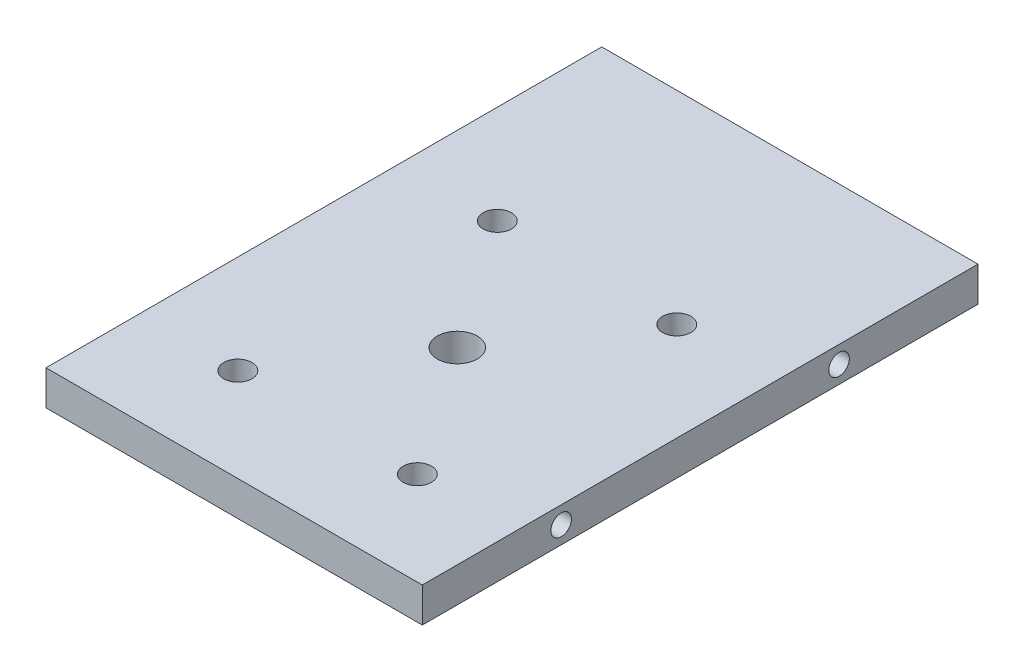
ISO-10303-21;
HEADER;
FILE_DESCRIPTION(('STEP AP214'),'2;1');
FILE_NAME('part.step','',(''),(''),'','','');
FILE_SCHEMA(('AUTOMOTIVE_DESIGN { 1 0 10303 214 1 1 1 1 }'));
ENDSEC;
DATA;
#1=APPLICATION_CONTEXT('core data for automotive mechanical design processes');
#2=APPLICATION_PROTOCOL_DEFINITION('international standard','automotive_design',2000,#1);
#3=PRODUCT_CONTEXT('',#1,'mechanical');
#4=PRODUCT('Part','Part','',(#3));
#5=PRODUCT_RELATED_PRODUCT_CATEGORY('part','',(#4));
#6=PRODUCT_DEFINITION_FORMATION('','',#4);
#7=PRODUCT_DEFINITION_CONTEXT('part definition',#1,'design');
#8=PRODUCT_DEFINITION('design','',#6,#7);
#9=PRODUCT_DEFINITION_SHAPE('','',#8);
#10=(LENGTH_UNIT() NAMED_UNIT(*) SI_UNIT(.MILLI.,.METRE.));
#11=(NAMED_UNIT(*) PLANE_ANGLE_UNIT() SI_UNIT($,.RADIAN.));
#12=(NAMED_UNIT(*) SI_UNIT($,.STERADIAN.) SOLID_ANGLE_UNIT());
#13=UNCERTAINTY_MEASURE_WITH_UNIT(LENGTH_MEASURE(1.E-05),#10,'distance_accuracy_value','');
#14=(GEOMETRIC_REPRESENTATION_CONTEXT(3) GLOBAL_UNCERTAINTY_ASSIGNED_CONTEXT((#13)) GLOBAL_UNIT_ASSIGNED_CONTEXT((#10,
#11,#12)) REPRESENTATION_CONTEXT('',''));
#15=CARTESIAN_POINT('',(0.,0.,0.));
#16=DIRECTION('',(0.,0.,1.));
#17=DIRECTION('',(1.,0.,0.));
#18=AXIS2_PLACEMENT_3D('',#15,#16,#17);
#19=CARTESIAN_POINT('',(0.,3.,0.));
#20=DIRECTION('',(1.,0.,0.));
#21=DIRECTION('',(0.,0.,-1.));
#22=AXIS2_PLACEMENT_3D('',#19,#20,#21);
#23=PLANE('',#22);
#24=CARTESIAN_POINT('',(0.,1.5,-36.));
#25=DIRECTION('',(-1.,0.,0.));
#26=DIRECTION('',(0.,0.,1.));
#27=AXIS2_PLACEMENT_3D('',#24,#25,#26);
#28=CIRCLE('',#27,0.889);
#29=CARTESIAN_POINT('',(0.,1.5,-35.111));
#30=VERTEX_POINT('',#29);
#31=EDGE_CURVE('E126',#30,#30,#28,.T.);
#32=ORIENTED_EDGE('',*,*,#31,.F.);
#33=EDGE_LOOP('',(#32));
#34=FACE_BOUND('',#33,.T.);
#35=CARTESIAN_POINT('',(0.,1.5,-12.));
#36=DIRECTION('',(-1.,0.,0.));
#37=DIRECTION('',(0.,0.,1.));
#38=AXIS2_PLACEMENT_3D('',#35,#36,#37);
#39=CIRCLE('',#38,0.889);
#40=CARTESIAN_POINT('',(0.,1.5,-11.111));
#41=VERTEX_POINT('',#40);
#42=EDGE_CURVE('E132',#41,#41,#39,.T.);
#43=ORIENTED_EDGE('',*,*,#42,.F.);
#44=EDGE_LOOP('',(#43));
#45=FACE_BOUND('',#44,.T.);
#46=DIRECTION('',(0.,0.,1.));
#47=VECTOR('',#46,1.);
#48=CARTESIAN_POINT('',(0.,0.,0.));
#49=LINE('',#48,#47);
#50=CARTESIAN_POINT('',(0.,0.,-48.));
#51=VERTEX_POINT('',#50);
#52=CARTESIAN_POINT('',(0.,0.,0.));
#53=VERTEX_POINT('',#52);
#54=EDGE_CURVE('E138',#51,#53,#49,.T.);
#55=ORIENTED_EDGE('',*,*,#54,.T.);
#56=DIRECTION('',(0.,-1.,0.));
#57=VECTOR('',#56,1.);
#58=CARTESIAN_POINT('',(0.,3.,0.));
#59=LINE('',#58,#57);
#60=CARTESIAN_POINT('',(0.,3.,0.));
#61=VERTEX_POINT('',#60);
#62=EDGE_CURVE('E11',#61,#53,#59,.T.);
#63=ORIENTED_EDGE('',*,*,#62,.F.);
#64=DIRECTION('',(0.,0.,1.));
#65=VECTOR('',#64,1.);
#66=CARTESIAN_POINT('',(0.,3.,0.));
#67=LINE('',#66,#65);
#68=CARTESIAN_POINT('',(0.,3.,-48.));
#69=VERTEX_POINT('',#68);
#70=EDGE_CURVE('E139',#69,#61,#67,.T.);
#71=ORIENTED_EDGE('',*,*,#70,.F.);
#72=DIRECTION('',(0.,-1.,0.));
#73=VECTOR('',#72,1.);
#74=CARTESIAN_POINT('',(0.,3.,-48.));
#75=LINE('',#74,#73);
#76=EDGE_CURVE('E145',#69,#51,#75,.T.);
#77=ORIENTED_EDGE('',*,*,#76,.T.);
#78=EDGE_LOOP('',(#55,#63,#71,#77));
#79=FACE_BOUND('',#78,.T.);
#80=ADVANCED_FACE('F43',(#34,#45,#79),#23,.F.);
#81=CARTESIAN_POINT('',(0.,3.,0.));
#82=DIRECTION('',(0.,0.,-1.));
#83=DIRECTION('',(-1.,0.,0.));
#84=AXIS2_PLACEMENT_3D('',#81,#82,#83);
#85=PLANE('',#84);
#86=DIRECTION('',(1.,0.,0.));
#87=VECTOR('',#86,1.);
#88=CARTESIAN_POINT('',(0.,0.,0.));
#89=LINE('',#88,#87);
#90=CARTESIAN_POINT('',(32.5,0.,0.));
#91=VERTEX_POINT('',#90);
#92=EDGE_CURVE('E148',#53,#91,#89,.T.);
#93=ORIENTED_EDGE('',*,*,#92,.T.);
#94=DIRECTION('',(0.,-1.,0.));
#95=VECTOR('',#94,1.);
#96=CARTESIAN_POINT('',(32.5,3.,0.));
#97=LINE('',#96,#95);
#98=CARTESIAN_POINT('',(32.5,3.,0.));
#99=VERTEX_POINT('',#98);
#100=EDGE_CURVE('E51',#99,#91,#97,.T.);
#101=ORIENTED_EDGE('',*,*,#100,.F.);
#102=DIRECTION('',(1.,0.,0.));
#103=VECTOR('',#102,1.);
#104=CARTESIAN_POINT('',(0.,3.,0.));
#105=LINE('',#104,#103);
#106=EDGE_CURVE('E90',#61,#99,#105,.T.);
#107=ORIENTED_EDGE('',*,*,#106,.F.);
#108=ORIENTED_EDGE('',*,*,#62,.T.);
#109=EDGE_LOOP('',(#93,#101,#107,#108));
#110=FACE_BOUND('',#109,.T.);
#111=ADVANCED_FACE('F172',(#110),#85,.F.);
#112=CARTESIAN_POINT('',(32.5,3.,0.));
#113=DIRECTION('',(-1.,0.,0.));
#114=DIRECTION('',(0.,0.,1.));
#115=AXIS2_PLACEMENT_3D('',#112,#113,#114);
#116=PLANE('',#115);
#117=CARTESIAN_POINT('',(32.5,1.5,-12.));
#118=DIRECTION('',(1.,0.,0.));
#119=DIRECTION('',(0.,0.,-1.));
#120=AXIS2_PLACEMENT_3D('',#117,#118,#119);
#121=CIRCLE('',#120,0.888999999999989);
#122=CARTESIAN_POINT('',(32.5,1.5,-12.889));
#123=VERTEX_POINT('',#122);
#124=EDGE_CURVE('E114',#123,#123,#121,.T.);
#125=ORIENTED_EDGE('',*,*,#124,.F.);
#126=EDGE_LOOP('',(#125));
#127=FACE_BOUND('',#126,.T.);
#128=CARTESIAN_POINT('',(32.5,1.5,-36.));
#129=DIRECTION('',(1.,0.,0.));
#130=DIRECTION('',(0.,0.,-1.));
#131=AXIS2_PLACEMENT_3D('',#128,#129,#130);
#132=CIRCLE('',#131,0.888999999999989);
#133=CARTESIAN_POINT('',(32.5,1.5,-36.889));
#134=VERTEX_POINT('',#133);
#135=EDGE_CURVE('E113',#134,#134,#132,.T.);
#136=ORIENTED_EDGE('',*,*,#135,.F.);
#137=EDGE_LOOP('',(#136));
#138=FACE_BOUND('',#137,.T.);
#139=DIRECTION('',(0.,0.,-1.));
#140=VECTOR('',#139,1.);
#141=CARTESIAN_POINT('',(32.5,0.,0.));
#142=LINE('',#141,#140);
#143=CARTESIAN_POINT('',(32.5,0.,-48.));
#144=VERTEX_POINT('',#143);
#145=EDGE_CURVE('E77',#91,#144,#142,.T.);
#146=ORIENTED_EDGE('',*,*,#145,.T.);
#147=DIRECTION('',(0.,-1.,0.));
#148=VECTOR('',#147,1.);
#149=CARTESIAN_POINT('',(32.5,3.,-48.));
#150=LINE('',#149,#148);
#151=CARTESIAN_POINT('',(32.5,3.,-48.));
#152=VERTEX_POINT('',#151);
#153=EDGE_CURVE('E153',#152,#144,#150,.T.);
#154=ORIENTED_EDGE('',*,*,#153,.F.);
#155=DIRECTION('',(0.,0.,-1.));
#156=VECTOR('',#155,1.);
#157=CARTESIAN_POINT('',(32.5,3.,0.));
#158=LINE('',#157,#156);
#159=EDGE_CURVE('E142',#99,#152,#158,.T.);
#160=ORIENTED_EDGE('',*,*,#159,.F.);
#161=ORIENTED_EDGE('',*,*,#100,.T.);
#162=EDGE_LOOP('',(#146,#154,#160,#161));
#163=FACE_BOUND('',#162,.T.);
#164=ADVANCED_FACE('F155',(#127,#138,#163),#116,.F.);
#165=CARTESIAN_POINT('',(0.,3.,-48.));
#166=DIRECTION('',(0.,0.,1.));
#167=DIRECTION('',(1.,0.,0.));
#168=AXIS2_PLACEMENT_3D('',#165,#166,#167);
#169=PLANE('',#168);
#170=DIRECTION('',(-1.,0.,0.));
#171=VECTOR('',#170,1.);
#172=CARTESIAN_POINT('',(0.,0.,-48.));
#173=LINE('',#172,#171);
#174=EDGE_CURVE('E83',#144,#51,#173,.T.);
#175=ORIENTED_EDGE('',*,*,#174,.T.);
#176=ORIENTED_EDGE('',*,*,#76,.F.);
#177=DIRECTION('',(-1.,0.,0.));
#178=VECTOR('',#177,1.);
#179=CARTESIAN_POINT('',(0.,3.,-48.));
#180=LINE('',#179,#178);
#181=EDGE_CURVE('E59',#152,#69,#180,.T.);
#182=ORIENTED_EDGE('',*,*,#181,.F.);
#183=ORIENTED_EDGE('',*,*,#153,.T.);
#184=EDGE_LOOP('',(#175,#176,#182,#183));
#185=FACE_BOUND('',#184,.T.);
#186=ADVANCED_FACE('F162',(#185),#169,.F.);
#187=CARTESIAN_POINT('',(0.,3.,0.));
#188=DIRECTION('',(0.,-1.,0.));
#189=DIRECTION('',(0.,0.,-1.));
#190=AXIS2_PLACEMENT_3D('',#187,#188,#189);
#191=PLANE('',#190);
#192=CARTESIAN_POINT('',(24.,3.,-30.48));
#193=DIRECTION('',(0.,1.,0.));
#194=DIRECTION('',(0.,0.,1.));
#195=AXIS2_PLACEMENT_3D('',#192,#193,#194);
#196=CIRCLE('',#195,1.22);
#197=CARTESIAN_POINT('',(24.,3.,-29.26));
#198=VERTEX_POINT('',#197);
#199=EDGE_CURVE('E237',#198,#198,#196,.T.);
#200=ORIENTED_EDGE('',*,*,#199,.F.);
#201=EDGE_LOOP('',(#200));
#202=FACE_BOUND('',#201,.T.);
#203=CARTESIAN_POINT('',(8.5,3.,-8.07));
#204=DIRECTION('',(0.,1.,0.));
#205=DIRECTION('',(0.,0.,1.));
#206=AXIS2_PLACEMENT_3D('',#203,#204,#205);
#207=CIRCLE('',#206,1.22);
#208=CARTESIAN_POINT('',(8.5,3.,-6.85));
#209=VERTEX_POINT('',#208);
#210=EDGE_CURVE('E233',#209,#209,#207,.T.);
#211=ORIENTED_EDGE('',*,*,#210,.F.);
#212=EDGE_LOOP('',(#211));
#213=FACE_BOUND('',#212,.T.);
#214=CARTESIAN_POINT('',(24.,3.,-8.07));
#215=DIRECTION('',(0.,1.,0.));
#216=DIRECTION('',(0.,0.,1.));
#217=AXIS2_PLACEMENT_3D('',#214,#215,#216);
#218=CIRCLE('',#217,1.22);
#219=CARTESIAN_POINT('',(24.,3.,-6.85));
#220=VERTEX_POINT('',#219);
#221=EDGE_CURVE('E241',#220,#220,#218,.T.);
#222=ORIENTED_EDGE('',*,*,#221,.F.);
#223=EDGE_LOOP('',(#222));
#224=FACE_BOUND('',#223,.T.);
#225=CARTESIAN_POINT('',(8.5,3.,-30.48));
#226=DIRECTION('',(0.,1.,0.));
#227=DIRECTION('',(0.,0.,1.));
#228=AXIS2_PLACEMENT_3D('',#225,#226,#227);
#229=CIRCLE('',#228,1.22);
#230=CARTESIAN_POINT('',(8.5,3.,-29.26));
#231=VERTEX_POINT('',#230);
#232=EDGE_CURVE('E229',#231,#231,#229,.T.);
#233=ORIENTED_EDGE('',*,*,#232,.F.);
#234=EDGE_LOOP('',(#233));
#235=FACE_BOUND('',#234,.T.);
#236=CARTESIAN_POINT('',(16.25,3.,-19.275));
#237=DIRECTION('',(0.,1.,0.));
#238=DIRECTION('',(0.,0.,1.));
#239=AXIS2_PLACEMENT_3D('',#236,#237,#238);
#240=CIRCLE('',#239,1.7272);
#241=CARTESIAN_POINT('',(16.25,3.,-17.5478));
#242=VERTEX_POINT('',#241);
#243=EDGE_CURVE('E225',#242,#242,#240,.T.);
#244=ORIENTED_EDGE('',*,*,#243,.F.);
#245=EDGE_LOOP('',(#244));
#246=FACE_BOUND('',#245,.T.);
#247=ORIENTED_EDGE('',*,*,#70,.T.);
#248=ORIENTED_EDGE('',*,*,#106,.T.);
#249=ORIENTED_EDGE('',*,*,#159,.T.);
#250=ORIENTED_EDGE('',*,*,#181,.T.);
#251=EDGE_LOOP('',(#247,#248,#249,#250));
#252=FACE_BOUND('',#251,.T.);
#253=ADVANCED_FACE('F164',(#202,#213,#224,#235,#246,#252),#191,.F.);
#254=CARTESIAN_POINT('',(0.,0.,0.));
#255=DIRECTION('',(0.,-1.,0.));
#256=DIRECTION('',(0.,0.,-1.));
#257=AXIS2_PLACEMENT_3D('',#254,#255,#256);
#258=PLANE('',#257);
#259=CARTESIAN_POINT('',(24.,0.,-30.48));
#260=DIRECTION('',(0.,1.,0.));
#261=DIRECTION('',(0.,0.,1.));
#262=AXIS2_PLACEMENT_3D('',#259,#260,#261);
#263=CIRCLE('',#262,1.22);
#264=CARTESIAN_POINT('',(24.,0.,-29.26));
#265=VERTEX_POINT('',#264);
#266=EDGE_CURVE('E209',#265,#265,#263,.T.);
#267=ORIENTED_EDGE('',*,*,#266,.T.);
#268=EDGE_LOOP('',(#267));
#269=FACE_BOUND('',#268,.T.);
#270=CARTESIAN_POINT('',(8.5,0.,-8.07));
#271=DIRECTION('',(0.,1.,0.));
#272=DIRECTION('',(0.,0.,1.));
#273=AXIS2_PLACEMENT_3D('',#270,#271,#272);
#274=CIRCLE('',#273,1.22);
#275=CARTESIAN_POINT('',(8.5,0.,-6.85));
#276=VERTEX_POINT('',#275);
#277=EDGE_CURVE('E213',#276,#276,#274,.T.);
#278=ORIENTED_EDGE('',*,*,#277,.T.);
#279=EDGE_LOOP('',(#278));
#280=FACE_BOUND('',#279,.T.);
#281=CARTESIAN_POINT('',(24.,0.,-8.07));
#282=DIRECTION('',(0.,1.,0.));
#283=DIRECTION('',(0.,0.,1.));
#284=AXIS2_PLACEMENT_3D('',#281,#282,#283);
#285=CIRCLE('',#284,1.22);
#286=CARTESIAN_POINT('',(24.,0.,-6.85));
#287=VERTEX_POINT('',#286);
#288=EDGE_CURVE('E217',#287,#287,#285,.T.);
#289=ORIENTED_EDGE('',*,*,#288,.T.);
#290=EDGE_LOOP('',(#289));
#291=FACE_BOUND('',#290,.T.);
#292=CARTESIAN_POINT('',(8.5,0.,-30.48));
#293=DIRECTION('',(0.,1.,0.));
#294=DIRECTION('',(0.,0.,1.));
#295=AXIS2_PLACEMENT_3D('',#292,#293,#294);
#296=CIRCLE('',#295,1.22);
#297=CARTESIAN_POINT('',(8.5,0.,-29.26));
#298=VERTEX_POINT('',#297);
#299=EDGE_CURVE('E221',#298,#298,#296,.T.);
#300=ORIENTED_EDGE('',*,*,#299,.T.);
#301=EDGE_LOOP('',(#300));
#302=FACE_BOUND('',#301,.T.);
#303=CARTESIAN_POINT('',(16.25,0.,-19.275));
#304=DIRECTION('',(0.,-1.,0.));
#305=DIRECTION('',(0.,0.,-1.));
#306=AXIS2_PLACEMENT_3D('',#303,#304,#305);
#307=CIRCLE('',#306,1.7272);
#308=CARTESIAN_POINT('',(16.25,0.,-21.0022));
#309=VERTEX_POINT('',#308);
#310=EDGE_CURVE('E120',#309,#309,#307,.T.);
#311=ORIENTED_EDGE('',*,*,#310,.F.);
#312=EDGE_LOOP('',(#311));
#313=FACE_BOUND('',#312,.T.);
#314=ORIENTED_EDGE('',*,*,#54,.F.);
#315=ORIENTED_EDGE('',*,*,#174,.F.);
#316=ORIENTED_EDGE('',*,*,#145,.F.);
#317=ORIENTED_EDGE('',*,*,#92,.F.);
#318=EDGE_LOOP('',(#314,#315,#316,#317));
#319=FACE_BOUND('',#318,.T.);
#320=ADVANCED_FACE('F158',(#269,#280,#291,#302,#313,#319),#258,.T.);
#321=CARTESIAN_POINT('',(7.4658349096845,1.5,-12.));
#322=DIRECTION('',(-1.,0.,0.));
#323=DIRECTION('',(0.,0.,1.));
#324=AXIS2_PLACEMENT_3D('',#321,#322,#323);
#325=CONICAL_SURFACE('',#324,0.888999999999998,1.02974425867665);
#326=CARTESIAN_POINT('',(8.,1.5,-12.));
#327=VERTEX_POINT('',#326);
#328=VERTEX_LOOP('',#327);
#329=FACE_BOUND('',#328,.T.);
#330=CARTESIAN_POINT('',(7.4658349096845,1.5,-12.));
#331=DIRECTION('',(-1.,0.,0.));
#332=DIRECTION('',(0.,0.,1.));
#333=AXIS2_PLACEMENT_3D('',#330,#331,#332);
#334=CIRCLE('',#333,0.888999999999998);
#335=CARTESIAN_POINT('',(7.4658349096845,1.5,-11.111));
#336=VERTEX_POINT('',#335);
#337=EDGE_CURVE('E135',#336,#336,#334,.T.);
#338=ORIENTED_EDGE('',*,*,#337,.T.);
#339=EDGE_LOOP('',(#338));
#340=FACE_BOUND('',#339,.T.);
#341=ADVANCED_FACE('F188',(#329,#340),#325,.F.);
#342=CARTESIAN_POINT('',(0.,1.5,-12.));
#343=DIRECTION('',(-1.,0.,0.));
#344=DIRECTION('',(0.,0.,1.));
#345=AXIS2_PLACEMENT_3D('',#342,#343,#344);
#346=CYLINDRICAL_SURFACE('',#345,0.888999999999999);
#347=ORIENTED_EDGE('',*,*,#337,.F.);
#348=EDGE_LOOP('',(#347));
#349=FACE_BOUND('',#348,.T.);
#350=ORIENTED_EDGE('',*,*,#42,.T.);
#351=EDGE_LOOP('',(#350));
#352=FACE_BOUND('',#351,.T.);
#353=ADVANCED_FACE('F185',(#349,#352),#346,.F.);
#354=CARTESIAN_POINT('',(7.4658349096845,1.5,-36.));
#355=DIRECTION('',(-1.,0.,0.));
#356=DIRECTION('',(0.,0.,1.));
#357=AXIS2_PLACEMENT_3D('',#354,#355,#356);
#358=CONICAL_SURFACE('',#357,0.888999999999998,1.02974425867665);
#359=CARTESIAN_POINT('',(8.,1.5,-36.));
#360=VERTEX_POINT('',#359);
#361=VERTEX_LOOP('',#360);
#362=FACE_BOUND('',#361,.T.);
#363=CARTESIAN_POINT('',(7.4658349096845,1.5,-36.));
#364=DIRECTION('',(-1.,0.,0.));
#365=DIRECTION('',(0.,0.,1.));
#366=AXIS2_PLACEMENT_3D('',#363,#364,#365);
#367=CIRCLE('',#366,0.888999999999998);
#368=CARTESIAN_POINT('',(7.4658349096845,1.5,-35.111));
#369=VERTEX_POINT('',#368);
#370=EDGE_CURVE('E129',#369,#369,#367,.T.);
#371=ORIENTED_EDGE('',*,*,#370,.T.);
#372=EDGE_LOOP('',(#371));
#373=FACE_BOUND('',#372,.T.);
#374=ADVANCED_FACE('F187',(#362,#373),#358,.F.);
#375=CARTESIAN_POINT('',(0.,1.5,-36.));
#376=DIRECTION('',(-1.,0.,0.));
#377=DIRECTION('',(0.,0.,1.));
#378=AXIS2_PLACEMENT_3D('',#375,#376,#377);
#379=CYLINDRICAL_SURFACE('',#378,0.888999999999999);
#380=ORIENTED_EDGE('',*,*,#370,.F.);
#381=EDGE_LOOP('',(#380));
#382=FACE_BOUND('',#381,.T.);
#383=ORIENTED_EDGE('',*,*,#31,.T.);
#384=EDGE_LOOP('',(#383));
#385=FACE_BOUND('',#384,.T.);
#386=ADVANCED_FACE('F195',(#382,#385),#379,.F.);
#387=CARTESIAN_POINT('',(25.0341650903155,1.5,-36.));
#388=DIRECTION('',(1.,0.,0.));
#389=DIRECTION('',(0.,0.,-1.));
#390=AXIS2_PLACEMENT_3D('',#387,#388,#389);
#391=CONICAL_SURFACE('',#390,0.888999999999998,1.02974425867665);
#392=CARTESIAN_POINT('',(24.5,1.5,-36.));
#393=VERTEX_POINT('',#392);
#394=VERTEX_LOOP('',#393);
#395=FACE_BOUND('',#394,.T.);
#396=CARTESIAN_POINT('',(25.0341650903155,1.5,-36.));
#397=DIRECTION('',(1.,0.,0.));
#398=DIRECTION('',(0.,0.,-1.));
#399=AXIS2_PLACEMENT_3D('',#396,#397,#398);
#400=CIRCLE('',#399,0.888999999999998);
#401=CARTESIAN_POINT('',(25.0341650903155,1.5,-36.889));
#402=VERTEX_POINT('',#401);
#403=EDGE_CURVE('E117',#402,#402,#400,.T.);
#404=ORIENTED_EDGE('',*,*,#403,.T.);
#405=EDGE_LOOP('',(#404));
#406=FACE_BOUND('',#405,.T.);
#407=ADVANCED_FACE('F268',(#395,#406),#391,.F.);
#408=CARTESIAN_POINT('',(32.5,1.5,-36.));
#409=DIRECTION('',(1.,0.,0.));
#410=DIRECTION('',(0.,0.,-1.));
#411=AXIS2_PLACEMENT_3D('',#408,#409,#410);
#412=CYLINDRICAL_SURFACE('',#411,0.888999999999994);
#413=ORIENTED_EDGE('',*,*,#403,.F.);
#414=EDGE_LOOP('',(#413));
#415=FACE_BOUND('',#414,.T.);
#416=ORIENTED_EDGE('',*,*,#135,.T.);
#417=EDGE_LOOP('',(#416));
#418=FACE_BOUND('',#417,.T.);
#419=ADVANCED_FACE('F107',(#415,#418),#412,.F.);
#420=CARTESIAN_POINT('',(25.0341650903155,1.5,-12.));
#421=DIRECTION('',(1.,0.,0.));
#422=DIRECTION('',(0.,0.,-1.));
#423=AXIS2_PLACEMENT_3D('',#420,#421,#422);
#424=CONICAL_SURFACE('',#423,0.888999999999998,1.02974425867665);
#425=CARTESIAN_POINT('',(24.5,1.5,-12.));
#426=VERTEX_POINT('',#425);
#427=VERTEX_LOOP('',#426);
#428=FACE_BOUND('',#427,.T.);
#429=CARTESIAN_POINT('',(25.0341650903155,1.5,-12.));
#430=DIRECTION('',(1.,0.,0.));
#431=DIRECTION('',(0.,0.,-1.));
#432=AXIS2_PLACEMENT_3D('',#429,#430,#431);
#433=CIRCLE('',#432,0.888999999999998);
#434=CARTESIAN_POINT('',(25.0341650903155,1.5,-12.889));
#435=VERTEX_POINT('',#434);
#436=EDGE_CURVE('E111',#435,#435,#433,.T.);
#437=ORIENTED_EDGE('',*,*,#436,.T.);
#438=EDGE_LOOP('',(#437));
#439=FACE_BOUND('',#438,.T.);
#440=ADVANCED_FACE('F103',(#428,#439),#424,.F.);
#441=CARTESIAN_POINT('',(32.5,1.5,-12.));
#442=DIRECTION('',(1.,0.,0.));
#443=DIRECTION('',(0.,0.,-1.));
#444=AXIS2_PLACEMENT_3D('',#441,#442,#443);
#445=CYLINDRICAL_SURFACE('',#444,0.888999999999994);
#446=ORIENTED_EDGE('',*,*,#436,.F.);
#447=EDGE_LOOP('',(#446));
#448=FACE_BOUND('',#447,.T.);
#449=ORIENTED_EDGE('',*,*,#124,.T.);
#450=EDGE_LOOP('',(#449));
#451=FACE_BOUND('',#450,.T.);
#452=ADVANCED_FACE('F106',(#448,#451),#445,.F.);
#453=CARTESIAN_POINT('',(16.25,3.,-19.275));
#454=DIRECTION('',(0.,1.,0.));
#455=DIRECTION('',(0.,0.,1.));
#456=AXIS2_PLACEMENT_3D('',#453,#454,#455);
#457=CYLINDRICAL_SURFACE('',#456,1.7272);
#458=ORIENTED_EDGE('',*,*,#310,.T.);
#459=EDGE_LOOP('',(#458));
#460=FACE_BOUND('',#459,.T.);
#461=ORIENTED_EDGE('',*,*,#243,.T.);
#462=EDGE_LOOP('',(#461));
#463=FACE_BOUND('',#462,.T.);
#464=ADVANCED_FACE('F253',(#460,#463),#457,.F.);
#465=CARTESIAN_POINT('',(8.5,0.,-30.48));
#466=DIRECTION('',(0.,1.,0.));
#467=DIRECTION('',(0.,0.,1.));
#468=AXIS2_PLACEMENT_3D('',#465,#466,#467);
#469=CYLINDRICAL_SURFACE('',#468,1.22);
#470=ORIENTED_EDGE('',*,*,#299,.F.);
#471=EDGE_LOOP('',(#470));
#472=FACE_BOUND('',#471,.T.);
#473=ORIENTED_EDGE('',*,*,#232,.T.);
#474=EDGE_LOOP('',(#473));
#475=FACE_BOUND('',#474,.T.);
#476=ADVANCED_FACE('F255',(#472,#475),#469,.F.);
#477=CARTESIAN_POINT('',(24.,0.,-8.07));
#478=DIRECTION('',(0.,1.,0.));
#479=DIRECTION('',(0.,0.,1.));
#480=AXIS2_PLACEMENT_3D('',#477,#478,#479);
#481=CYLINDRICAL_SURFACE('',#480,1.22);
#482=ORIENTED_EDGE('',*,*,#288,.F.);
#483=EDGE_LOOP('',(#482));
#484=FACE_BOUND('',#483,.T.);
#485=ORIENTED_EDGE('',*,*,#221,.T.);
#486=EDGE_LOOP('',(#485));
#487=FACE_BOUND('',#486,.T.);
#488=ADVANCED_FACE('F246',(#484,#487),#481,.F.);
#489=CARTESIAN_POINT('',(8.5,0.,-8.07));
#490=DIRECTION('',(0.,1.,0.));
#491=DIRECTION('',(0.,0.,1.));
#492=AXIS2_PLACEMENT_3D('',#489,#490,#491);
#493=CYLINDRICAL_SURFACE('',#492,1.22);
#494=ORIENTED_EDGE('',*,*,#277,.F.);
#495=EDGE_LOOP('',(#494));
#496=FACE_BOUND('',#495,.T.);
#497=ORIENTED_EDGE('',*,*,#210,.T.);
#498=EDGE_LOOP('',(#497));
#499=FACE_BOUND('',#498,.T.);
#500=ADVANCED_FACE('F343',(#496,#499),#493,.F.);
#501=CARTESIAN_POINT('',(24.,0.,-30.48));
#502=DIRECTION('',(0.,1.,0.));
#503=DIRECTION('',(0.,0.,1.));
#504=AXIS2_PLACEMENT_3D('',#501,#502,#503);
#505=CYLINDRICAL_SURFACE('',#504,1.22);
#506=ORIENTED_EDGE('',*,*,#266,.F.);
#507=EDGE_LOOP('',(#506));
#508=FACE_BOUND('',#507,.T.);
#509=ORIENTED_EDGE('',*,*,#199,.T.);
#510=EDGE_LOOP('',(#509));
#511=FACE_BOUND('',#510,.T.);
#512=ADVANCED_FACE('F353',(#508,#511),#505,.F.);
#513=CLOSED_SHELL('',(#80,#111,#164,#186,#253,#320,#341,#353,#374,#386,#407,#419,#440,#452,#464,
#476,#488,#500,#512));
#514=MANIFOLD_SOLID_BREP('B2',#513);
#515=ADVANCED_BREP_SHAPE_REPRESENTATION('',(#18,#514),#14);
#516=SHAPE_DEFINITION_REPRESENTATION(#9,#515);
ENDSEC;
END-ISO-10303-21;
